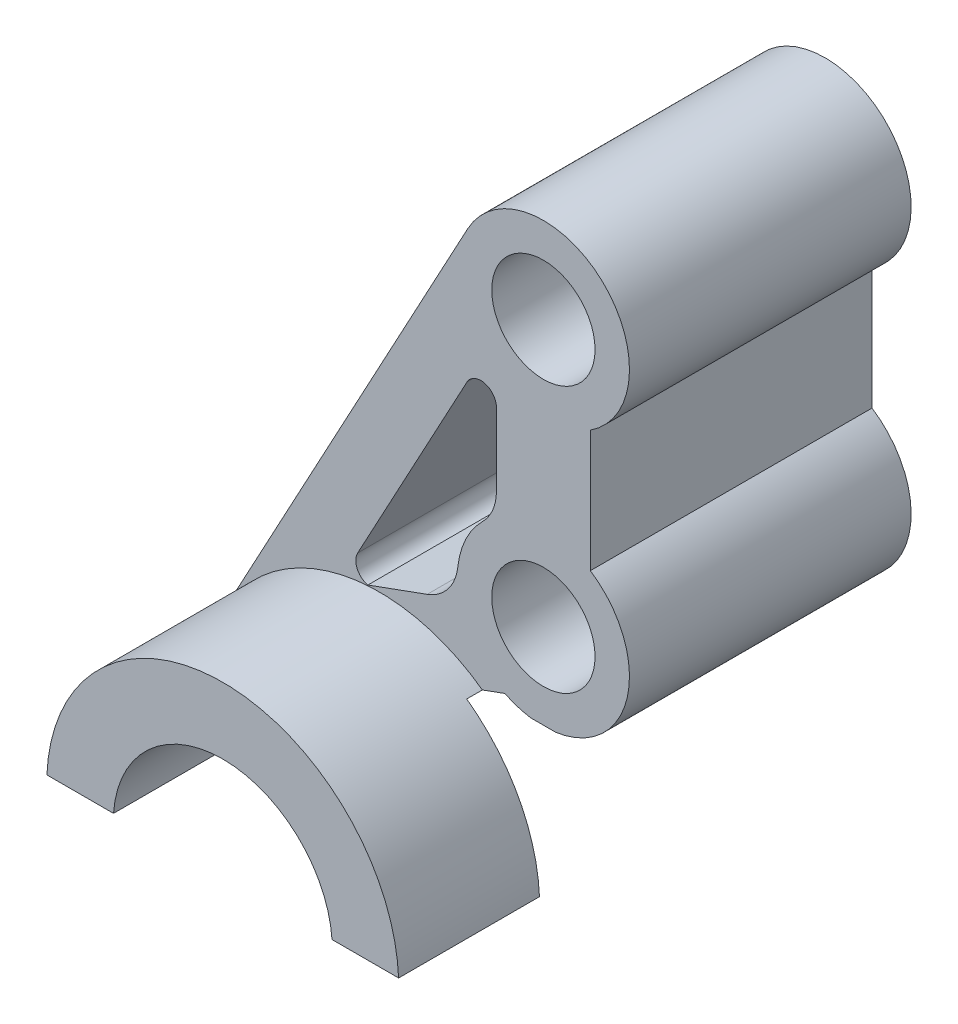
ISO-10303-21;
HEADER;
FILE_DESCRIPTION(('STEP AP214'),'2;1');
FILE_NAME('part.step','',(''),(''),'','','');
FILE_SCHEMA(('AUTOMOTIVE_DESIGN { 1 0 10303 214 1 1 1 1 }'));
ENDSEC;
DATA;
#1=APPLICATION_CONTEXT('core data for automotive mechanical design processes');
#2=APPLICATION_PROTOCOL_DEFINITION('international standard','automotive_design',2000,#1);
#3=PRODUCT_CONTEXT('',#1,'mechanical');
#4=PRODUCT('Part','Part','',(#3));
#5=PRODUCT_RELATED_PRODUCT_CATEGORY('part','',(#4));
#6=PRODUCT_DEFINITION_FORMATION('','',#4);
#7=PRODUCT_DEFINITION_CONTEXT('part definition',#1,'design');
#8=PRODUCT_DEFINITION('design','',#6,#7);
#9=PRODUCT_DEFINITION_SHAPE('','',#8);
#10=(LENGTH_UNIT() NAMED_UNIT(*) SI_UNIT(.MILLI.,.METRE.));
#11=(NAMED_UNIT(*) PLANE_ANGLE_UNIT() SI_UNIT($,.RADIAN.));
#12=(NAMED_UNIT(*) SI_UNIT($,.STERADIAN.) SOLID_ANGLE_UNIT());
#13=UNCERTAINTY_MEASURE_WITH_UNIT(LENGTH_MEASURE(1.E-05),#10,'distance_accuracy_value','');
#14=(GEOMETRIC_REPRESENTATION_CONTEXT(3) GLOBAL_UNCERTAINTY_ASSIGNED_CONTEXT((#13)) GLOBAL_UNIT_ASSIGNED_CONTEXT((#10,
#11,#12)) REPRESENTATION_CONTEXT('',''));
#15=CARTESIAN_POINT('',(0.,0.,0.));
#16=DIRECTION('',(0.,0.,1.));
#17=DIRECTION('',(1.,0.,0.));
#18=AXIS2_PLACEMENT_3D('',#15,#16,#17);
#19=CARTESIAN_POINT('',(0.,0.,2.));
#20=DIRECTION('',(0.,0.,-1.));
#21=DIRECTION('',(-1.,0.,0.));
#22=AXIS2_PLACEMENT_3D('',#19,#20,#21);
#23=CYLINDRICAL_SURFACE('',#22,5.5);
#24=CARTESIAN_POINT('',(0.,0.,-16.));
#25=DIRECTION('',(0.,0.,-1.));
#26=DIRECTION('',(-1.,0.,0.));
#27=AXIS2_PLACEMENT_3D('',#24,#25,#26);
#28=CIRCLE('',#27,5.5);
#29=CARTESIAN_POINT('',(3.,4.60977222864644,-16.));
#30=VERTEX_POINT('',#29);
#31=CARTESIAN_POINT('',(0.759288212759851,-5.4473370934764,-16.));
#32=VERTEX_POINT('',#31);
#33=EDGE_CURVE('E486',#30,#32,#28,.T.);
#34=ORIENTED_EDGE('',*,*,#33,.F.);
#35=DIRECTION('',(0.,0.,-1.));
#36=VECTOR('',#35,1.);
#37=CARTESIAN_POINT('',(3.,4.60977222864644,2.));
#38=LINE('',#37,#36);
#39=CARTESIAN_POINT('',(3.,4.60977222864644,2.));
#40=VERTEX_POINT('',#39);
#41=EDGE_CURVE('E354',#40,#30,#38,.T.);
#42=ORIENTED_EDGE('',*,*,#41,.F.);
#43=CARTESIAN_POINT('',(0.,0.,2.));
#44=DIRECTION('',(0.,0.,1.));
#45=DIRECTION('',(1.,0.,0.));
#46=AXIS2_PLACEMENT_3D('',#43,#44,#45);
#47=CIRCLE('',#46,5.5);
#48=CARTESIAN_POINT('',(0.759288212759851,-5.4473370934764,2.));
#49=VERTEX_POINT('',#48);
#50=EDGE_CURVE('E379',#49,#40,#47,.T.);
#51=ORIENTED_EDGE('',*,*,#50,.F.);
#52=DIRECTION('',(0.,0.,-1.));
#53=VECTOR('',#52,1.);
#54=CARTESIAN_POINT('',(0.759288212759851,-5.4473370934764,2.));
#55=LINE('',#54,#53);
#56=EDGE_CURVE('E419',#49,#32,#55,.T.);
#57=ORIENTED_EDGE('',*,*,#56,.T.);
#58=EDGE_LOOP('',(#34,#42,#51,#57));
#59=FACE_BOUND('',#58,.T.);
#60=ADVANCED_FACE('F65',(#59),#23,.T.);
#61=CARTESIAN_POINT('',(-10.4907117872402,-14.5574924236124,-17.));
#62=DIRECTION('',(0.,0.,1.));
#63=DIRECTION('',(1.,0.,0.));
#64=AXIS2_PLACEMENT_3D('',#61,#62,#63);
#65=CYLINDRICAL_SURFACE('',#64,11.25);
#66=DIRECTION('',(0.,0.,1.));
#67=VECTOR('',#66,1.);
#68=CARTESIAN_POINT('',(-20.3918783273174,-9.21620033782877,-17.));
#69=LINE('',#68,#67);
#70=CARTESIAN_POINT('',(-20.3918783273174,-9.21620033782877,-16.));
#71=VERTEX_POINT('',#70);
#72=CARTESIAN_POINT('',(-20.3918783273174,-9.21620033782878,2.));
#73=VERTEX_POINT('',#72);
#74=EDGE_CURVE('E398',#71,#73,#69,.T.);
#75=ORIENTED_EDGE('',*,*,#74,.F.);
#76=CARTESIAN_POINT('',(-10.4907117872402,-14.5574924236124,-16.));
#77=DIRECTION('',(0.,0.,-1.));
#78=DIRECTION('',(-1.,0.,0.));
#79=AXIS2_PLACEMENT_3D('',#76,#77,#78);
#80=CIRCLE('',#79,11.25);
#81=CARTESIAN_POINT('',(-21.7295951837347,-14.0574924236124,-16.));
#82=VERTEX_POINT('',#81);
#83=EDGE_CURVE('E489',#71,#82,#80,.F.);
#84=ORIENTED_EDGE('',*,*,#83,.T.);
#85=DIRECTION('',(0.,0.,1.));
#86=VECTOR('',#85,1.);
#87=CARTESIAN_POINT('',(-21.7295951837347,-14.0574924236124,-17.));
#88=LINE('',#87,#86);
#89=CARTESIAN_POINT('',(-21.7295951837347,-14.0574924236124,12.));
#90=VERTEX_POINT('',#89);
#91=EDGE_CURVE('E328',#82,#90,#88,.T.);
#92=ORIENTED_EDGE('',*,*,#91,.T.);
#93=CARTESIAN_POINT('',(-10.4907117872402,-14.5574924236124,12.));
#94=DIRECTION('',(0.,0.,1.));
#95=DIRECTION('',(1.,0.,0.));
#96=AXIS2_PLACEMENT_3D('',#93,#94,#95);
#97=CIRCLE('',#96,11.25);
#98=CARTESIAN_POINT('',(0.748171609254361,-14.0574924236124,12.));
#99=VERTEX_POINT('',#98);
#100=EDGE_CURVE('E343',#99,#90,#97,.T.);
#101=ORIENTED_EDGE('',*,*,#100,.F.);
#102=DIRECTION('',(0.,0.,1.));
#103=VECTOR('',#102,1.);
#104=CARTESIAN_POINT('',(0.748171609254361,-14.0574924236124,-27.));
#105=LINE('',#104,#103);
#106=CARTESIAN_POINT('',(0.748171609254361,-14.0574924236124,3.));
#107=VERTEX_POINT('',#106);
#108=EDGE_CURVE('E331',#107,#99,#105,.T.);
#109=ORIENTED_EDGE('',*,*,#108,.F.);
#110=CARTESIAN_POINT('',(-10.4907117872402,-14.5574924236124,3.));
#111=DIRECTION('',(0.,0.,-1.));
#112=DIRECTION('',(-1.,0.,0.));
#113=AXIS2_PLACEMENT_3D('',#110,#111,#112);
#114=CIRCLE('',#113,11.25);
#115=CARTESIAN_POINT('',(-3.90002088589102,-5.44018506656478,3.));
#116=VERTEX_POINT('',#115);
#117=EDGE_CURVE('E412',#107,#116,#114,.F.);
#118=ORIENTED_EDGE('',*,*,#117,.T.);
#119=DIRECTION('',(0.,0.,1.));
#120=VECTOR('',#119,1.);
#121=CARTESIAN_POINT('',(-3.90002088589102,-5.44018506656478,-17.));
#122=LINE('',#121,#120);
#123=CARTESIAN_POINT('',(-3.90002088589102,-5.44018506656478,2.));
#124=VERTEX_POINT('',#123);
#125=EDGE_CURVE('E433',#124,#116,#122,.T.);
#126=ORIENTED_EDGE('',*,*,#125,.F.);
#127=CARTESIAN_POINT('',(-10.4907117872402,-14.5574924236124,2.));
#128=DIRECTION('',(0.,0.,1.));
#129=DIRECTION('',(1.,0.,0.));
#130=AXIS2_PLACEMENT_3D('',#127,#128,#129);
#131=CIRCLE('',#130,11.25);
#132=CARTESIAN_POINT('',(-10.9485311233066,-3.31681177449134,2.));
#133=VERTEX_POINT('',#132);
#134=EDGE_CURVE('E327',#133,#124,#131,.F.);
#135=ORIENTED_EDGE('',*,*,#134,.F.);
#136=EDGE_CURVE('E324',#73,#133,#131,.F.);
#137=ORIENTED_EDGE('',*,*,#136,.F.);
#138=EDGE_LOOP('',(#75,#84,#92,#101,#109,#118,#126,#135,#137));
#139=FACE_BOUND('',#138,.T.);
#140=ADVANCED_FACE('F560',(#139),#65,.T.);
#141=CARTESIAN_POINT('',(0.,17.,2.));
#142=DIRECTION('',(0.,0.,-1.));
#143=DIRECTION('',(-1.,0.,0.));
#144=AXIS2_PLACEMENT_3D('',#141,#142,#143);
#145=CYLINDRICAL_SURFACE('',#144,5.5);
#146=CARTESIAN_POINT('',(0.,17.,-16.));
#147=DIRECTION('',(0.,0.,-1.));
#148=DIRECTION('',(-1.,0.,0.));
#149=AXIS2_PLACEMENT_3D('',#146,#147,#148);
#150=CIRCLE('',#149,5.5);
#151=CARTESIAN_POINT('',(-4.84057030848222,19.6112983530498,-16.));
#152=VERTEX_POINT('',#151);
#153=CARTESIAN_POINT('',(3.,12.3902277713536,-16.));
#154=VERTEX_POINT('',#153);
#155=EDGE_CURVE('E475',#152,#154,#150,.T.);
#156=ORIENTED_EDGE('',*,*,#155,.F.);
#157=DIRECTION('',(0.,0.,1.));
#158=VECTOR('',#157,1.);
#159=CARTESIAN_POINT('',(-4.84057030848222,19.6112983530498,-17.));
#160=LINE('',#159,#158);
#161=CARTESIAN_POINT('',(-4.84057030848222,19.6112983530498,2.));
#162=VERTEX_POINT('',#161);
#163=EDGE_CURVE('E399',#152,#162,#160,.T.);
#164=ORIENTED_EDGE('',*,*,#163,.T.);
#165=CARTESIAN_POINT('',(0.,17.,2.));
#166=DIRECTION('',(0.,0.,1.));
#167=DIRECTION('',(1.,0.,0.));
#168=AXIS2_PLACEMENT_3D('',#165,#166,#167);
#169=CIRCLE('',#168,5.5);
#170=CARTESIAN_POINT('',(3.,12.3902277713536,2.));
#171=VERTEX_POINT('',#170);
#172=EDGE_CURVE('E384',#171,#162,#169,.T.);
#173=ORIENTED_EDGE('',*,*,#172,.F.);
#174=DIRECTION('',(0.,0.,-1.));
#175=VECTOR('',#174,1.);
#176=CARTESIAN_POINT('',(3.,12.3902277713536,2.));
#177=LINE('',#176,#175);
#178=EDGE_CURVE('E358',#171,#154,#177,.T.);
#179=ORIENTED_EDGE('',*,*,#178,.T.);
#180=EDGE_LOOP('',(#156,#164,#173,#179));
#181=FACE_BOUND('',#180,.T.);
#182=ADVANCED_FACE('F554',(#181),#145,.T.);
#183=CARTESIAN_POINT('',(-10.4907117872402,-14.5574924236124,-17.));
#184=DIRECTION('',(0.,0.,1.));
#185=DIRECTION('',(1.,0.,0.));
#186=AXIS2_PLACEMENT_3D('',#183,#184,#185);
#187=CYLINDRICAL_SURFACE('',#186,7.);
#188=CARTESIAN_POINT('',(-10.4907117872402,-14.5574924236124,-16.));
#189=DIRECTION('',(0.,0.,-1.));
#190=DIRECTION('',(-1.,0.,0.));
#191=AXIS2_PLACEMENT_3D('',#188,#189,#190);
#192=CIRCLE('',#191,7.);
#193=CARTESIAN_POINT('',(-14.9736896929828,-9.18134983839169,-16.));
#194=VERTEX_POINT('',#193);
#195=CARTESIAN_POINT('',(-17.4728318091246,-14.0574924236124,-16.));
#196=VERTEX_POINT('',#195);
#197=EDGE_CURVE('E231',#194,#196,#192,.F.);
#198=ORIENTED_EDGE('',*,*,#197,.F.);
#199=DIRECTION('',(0.,0.,1.));
#200=VECTOR('',#199,1.);
#201=CARTESIAN_POINT('',(-14.9736896929828,-9.18134983839169,-17.));
#202=LINE('',#201,#200);
#203=CARTESIAN_POINT('',(-14.9736896929828,-9.18134983839169,3.));
#204=VERTEX_POINT('',#203);
#205=EDGE_CURVE('E241',#194,#204,#202,.T.);
#206=ORIENTED_EDGE('',*,*,#205,.T.);
#207=CARTESIAN_POINT('',(-10.4907117872402,-14.5574924236124,3.));
#208=DIRECTION('',(0.,0.,-1.));
#209=DIRECTION('',(-1.,0.,0.));
#210=AXIS2_PLACEMENT_3D('',#207,#208,#209);
#211=CIRCLE('',#210,7.);
#212=CARTESIAN_POINT('',(-3.50859176535568,-14.0574924236124,3.));
#213=VERTEX_POINT('',#212);
#214=EDGE_CURVE('E265',#213,#204,#211,.F.);
#215=ORIENTED_EDGE('',*,*,#214,.F.);
#216=DIRECTION('',(0.,0.,1.));
#217=VECTOR('',#216,1.);
#218=CARTESIAN_POINT('',(-3.50859176535568,-14.0574924236124,-27.));
#219=LINE('',#218,#217);
#220=CARTESIAN_POINT('',(-3.50859176535568,-14.0574924236124,12.));
#221=VERTEX_POINT('',#220);
#222=EDGE_CURVE('E334',#213,#221,#219,.T.);
#223=ORIENTED_EDGE('',*,*,#222,.T.);
#224=CARTESIAN_POINT('',(-10.4907117872402,-14.5574924236124,12.));
#225=DIRECTION('',(0.,0.,1.));
#226=DIRECTION('',(1.,0.,0.));
#227=AXIS2_PLACEMENT_3D('',#224,#225,#226);
#228=CIRCLE('',#227,7.);
#229=CARTESIAN_POINT('',(-17.4728318091246,-14.0574924236124,12.));
#230=VERTEX_POINT('',#229);
#231=EDGE_CURVE('E351',#221,#230,#228,.T.);
#232=ORIENTED_EDGE('',*,*,#231,.T.);
#233=DIRECTION('',(0.,0.,1.));
#234=VECTOR('',#233,1.);
#235=CARTESIAN_POINT('',(-17.4728318091246,-14.0574924236124,-17.));
#236=LINE('',#235,#234);
#237=EDGE_CURVE('E244',#196,#230,#236,.T.);
#238=ORIENTED_EDGE('',*,*,#237,.F.);
#239=EDGE_LOOP('',(#198,#206,#215,#223,#232,#238));
#240=FACE_BOUND('',#239,.T.);
#241=ADVANCED_FACE('F239',(#240),#187,.F.);
#242=CARTESIAN_POINT('',(0.,-14.0574924236124,-17.));
#243=DIRECTION('',(0.,1.,0.));
#244=DIRECTION('',(-1.,0.,0.));
#245=AXIS2_PLACEMENT_3D('',#242,#243,#244);
#246=PLANE('',#245);
#247=DIRECTION('',(-1.,0.,0.));
#248=VECTOR('',#247,1.);
#249=CARTESIAN_POINT('',(0.,-14.0574924236124,-16.));
#250=LINE('',#249,#248);
#251=EDGE_CURVE('E493',#196,#82,#250,.T.);
#252=ORIENTED_EDGE('',*,*,#251,.F.);
#253=ORIENTED_EDGE('',*,*,#237,.T.);
#254=DIRECTION('',(-1.,0.,0.));
#255=VECTOR('',#254,1.);
#256=CARTESIAN_POINT('',(0.,-14.0574924236124,12.));
#257=LINE('',#256,#255);
#258=EDGE_CURVE('E337',#230,#90,#257,.T.);
#259=ORIENTED_EDGE('',*,*,#258,.T.);
#260=ORIENTED_EDGE('',*,*,#91,.F.);
#261=EDGE_LOOP('',(#252,#253,#259,#260));
#262=FACE_BOUND('',#261,.T.);
#263=ADVANCED_FACE('F564',(#262),#246,.F.);
#264=CARTESIAN_POINT('',(0.,0.,-16.));
#265=DIRECTION('',(0.,0.,-1.));
#266=DIRECTION('',(-1.,0.,0.));
#267=AXIS2_PLACEMENT_3D('',#264,#265,#266);
#268=CIRCLE('',#267,5.5);
#269=CARTESIAN_POINT('',(-5.46847026730089,0.58807562068674,-16.));
#270=VERTEX_POINT('',#269);
#271=CARTESIAN_POINT('',(-3.88235294117647,3.89581001078574,-16.));
#272=VERTEX_POINT('',#271);
#273=EDGE_CURVE('E455',#270,#272,#268,.T.);
#274=ORIENTED_EDGE('',*,*,#273,.F.);
#275=DIRECTION('',(0.,0.,-1.));
#276=VECTOR('',#275,1.);
#277=CARTESIAN_POINT('',(-5.46847026730089,0.588075620686739,2.));
#278=LINE('',#277,#276);
#279=CARTESIAN_POINT('',(-5.46847026730089,0.588075620686739,2.));
#280=VERTEX_POINT('',#279);
#281=EDGE_CURVE('E314',#270,#280,#278,.F.);
#282=ORIENTED_EDGE('',*,*,#281,.T.);
#283=CARTESIAN_POINT('',(-3.88235294117647,3.89581001078574,2.));
#284=VERTEX_POINT('',#283);
#285=EDGE_CURVE('E374',#284,#280,#47,.T.);
#286=ORIENTED_EDGE('',*,*,#285,.F.);
#287=DIRECTION('',(0.,0.,-1.));
#288=VECTOR('',#287,1.);
#289=CARTESIAN_POINT('',(-3.88235294117647,3.89581001078574,2.));
#290=LINE('',#289,#288);
#291=EDGE_CURVE('E317',#284,#272,#290,.T.);
#292=ORIENTED_EDGE('',*,*,#291,.T.);
#293=EDGE_LOOP('',(#274,#282,#286,#292));
#294=FACE_BOUND('',#293,.T.);
#295=ADVANCED_FACE('F591',(#294),#23,.T.);
#296=CARTESIAN_POINT('',(0.,0.,-16.));
#297=DIRECTION('',(0.,0.,-1.));
#298=DIRECTION('',(-1.,0.,0.));
#299=AXIS2_PLACEMENT_3D('',#296,#297,#298);
#300=CIRCLE('',#299,5.5);
#301=CARTESIAN_POINT('',(-0.808941556310188,-5.44018506656478,-16.));
#302=VERTEX_POINT('',#301);
#303=CARTESIAN_POINT('',(-2.46361660128871,-4.91737666259711,-16.));
#304=VERTEX_POINT('',#303);
#305=EDGE_CURVE('E247',#302,#304,#300,.T.);
#306=ORIENTED_EDGE('',*,*,#305,.F.);
#307=DIRECTION('',(0.,0.,-1.));
#308=VECTOR('',#307,1.);
#309=CARTESIAN_POINT('',(-0.808941556310188,-5.44018506656478,2.));
#310=LINE('',#309,#308);
#311=CARTESIAN_POINT('',(-0.808941556310188,-5.44018506656478,2.));
#312=VERTEX_POINT('',#311);
#313=EDGE_CURVE('E426',#302,#312,#310,.F.);
#314=ORIENTED_EDGE('',*,*,#313,.T.);
#315=CARTESIAN_POINT('',(-2.46361660128871,-4.91737666259711,2.));
#316=VERTEX_POINT('',#315);
#317=EDGE_CURVE('E378',#316,#312,#47,.T.);
#318=ORIENTED_EDGE('',*,*,#317,.F.);
#319=DIRECTION('',(0.,0.,1.));
#320=VECTOR('',#319,1.);
#321=CARTESIAN_POINT('',(-2.46361660128871,-4.91737666259711,-17.));
#322=LINE('',#321,#320);
#323=EDGE_CURVE('E388',#304,#316,#322,.T.);
#324=ORIENTED_EDGE('',*,*,#323,.F.);
#325=EDGE_LOOP('',(#306,#314,#318,#324));
#326=FACE_BOUND('',#325,.T.);
#327=ADVANCED_FACE('F534',(#326),#23,.T.);
#328=CARTESIAN_POINT('',(-3.,0.,2.));
#329=DIRECTION('',(1.,0.,0.));
#330=DIRECTION('',(0.,1.,0.));
#331=AXIS2_PLACEMENT_3D('',#328,#329,#330);
#332=PLANE('',#331);
#333=DIRECTION('',(0.,1.,0.));
#334=VECTOR('',#333,1.);
#335=CARTESIAN_POINT('',(-3.,0.,-16.));
#336=LINE('',#335,#334);
#337=CARTESIAN_POINT('',(-3.,6.02079728939615,-16.));
#338=VERTEX_POINT('',#337);
#339=CARTESIAN_POINT('',(-3.,10.6383059352344,-16.));
#340=VERTEX_POINT('',#339);
#341=EDGE_CURVE('E458',#338,#340,#336,.T.);
#342=ORIENTED_EDGE('',*,*,#341,.F.);
#343=DIRECTION('',(0.,0.,1.));
#344=VECTOR('',#343,1.);
#345=CARTESIAN_POINT('',(-3.,6.02079728939615,2.));
#346=LINE('',#345,#344);
#347=CARTESIAN_POINT('',(-3.,6.02079728939615,2.));
#348=VERTEX_POINT('',#347);
#349=EDGE_CURVE('E307',#338,#348,#346,.T.);
#350=ORIENTED_EDGE('',*,*,#349,.T.);
#351=DIRECTION('',(0.,-1.,0.));
#352=VECTOR('',#351,1.);
#353=CARTESIAN_POINT('',(-3.,0.,2.));
#354=LINE('',#353,#352);
#355=CARTESIAN_POINT('',(-3.,10.6383059352344,2.));
#356=VERTEX_POINT('',#355);
#357=EDGE_CURVE('E380',#356,#348,#354,.T.);
#358=ORIENTED_EDGE('',*,*,#357,.F.);
#359=DIRECTION('',(0.,0.,1.));
#360=VECTOR('',#359,1.);
#361=CARTESIAN_POINT('',(-3.,10.6383059352344,2.));
#362=LINE('',#361,#360);
#363=EDGE_CURVE('E289',#356,#340,#362,.F.);
#364=ORIENTED_EDGE('',*,*,#363,.T.);
#365=EDGE_LOOP('',(#342,#350,#358,#364));
#366=FACE_BOUND('',#365,.T.);
#367=ADVANCED_FACE('F601',(#366),#332,.F.);
#368=CARTESIAN_POINT('',(0.,17.,2.));
#369=DIRECTION('',(0.,0.,-1.));
#370=DIRECTION('',(-1.,0.,0.));
#371=AXIS2_PLACEMENT_3D('',#368,#369,#370);
#372=CYLINDRICAL_SURFACE('',#371,3.3);
#373=CARTESIAN_POINT('',(0.,17.,2.));
#374=DIRECTION('',(0.,0.,1.));
#375=DIRECTION('',(1.,0.,0.));
#376=AXIS2_PLACEMENT_3D('',#373,#374,#375);
#377=CIRCLE('',#376,3.3);
#378=CARTESIAN_POINT('',(3.3,17.,2.));
#379=VERTEX_POINT('',#378);
#380=EDGE_CURVE('E366',#379,#379,#377,.T.);
#381=ORIENTED_EDGE('',*,*,#380,.T.);
#382=EDGE_LOOP('',(#381));
#383=FACE_BOUND('',#382,.T.);
#384=CARTESIAN_POINT('',(0.,17.,-16.));
#385=DIRECTION('',(0.,0.,-1.));
#386=DIRECTION('',(-1.,0.,0.));
#387=AXIS2_PLACEMENT_3D('',#384,#385,#386);
#388=CIRCLE('',#387,3.3);
#389=CARTESIAN_POINT('',(-3.3,17.,-16.));
#390=VERTEX_POINT('',#389);
#391=EDGE_CURVE('E444',#390,#390,#388,.T.);
#392=ORIENTED_EDGE('',*,*,#391,.T.);
#393=EDGE_LOOP('',(#392));
#394=FACE_BOUND('',#393,.T.);
#395=ADVANCED_FACE('F605',(#383,#394),#372,.F.);
#396=CARTESIAN_POINT('',(3.,0.,2.));
#397=DIRECTION('',(1.,0.,0.));
#398=DIRECTION('',(0.,1.,0.));
#399=AXIS2_PLACEMENT_3D('',#396,#397,#398);
#400=PLANE('',#399);
#401=ORIENTED_EDGE('',*,*,#41,.T.);
#402=DIRECTION('',(0.,1.,0.));
#403=VECTOR('',#402,1.);
#404=CARTESIAN_POINT('',(3.,0.,-16.));
#405=LINE('',#404,#403);
#406=EDGE_CURVE('E478',#30,#154,#405,.T.);
#407=ORIENTED_EDGE('',*,*,#406,.T.);
#408=ORIENTED_EDGE('',*,*,#178,.F.);
#409=DIRECTION('',(0.,-1.,0.));
#410=VECTOR('',#409,1.);
#411=CARTESIAN_POINT('',(3.,0.,2.));
#412=LINE('',#411,#410);
#413=EDGE_CURVE('E370',#171,#40,#412,.T.);
#414=ORIENTED_EDGE('',*,*,#413,.T.);
#415=EDGE_LOOP('',(#401,#407,#408,#414));
#416=FACE_BOUND('',#415,.T.);
#417=ADVANCED_FACE('F551',(#416),#400,.T.);
#418=CARTESIAN_POINT('',(0.,0.,2.));
#419=DIRECTION('',(0.,0.,-1.));
#420=DIRECTION('',(-1.,0.,0.));
#421=AXIS2_PLACEMENT_3D('',#418,#419,#420);
#422=CYLINDRICAL_SURFACE('',#421,3.3);
#423=CARTESIAN_POINT('',(0.,0.,2.));
#424=DIRECTION('',(0.,0.,1.));
#425=DIRECTION('',(1.,0.,0.));
#426=AXIS2_PLACEMENT_3D('',#423,#424,#425);
#427=CIRCLE('',#426,3.3);
#428=CARTESIAN_POINT('',(3.3,0.,2.));
#429=VERTEX_POINT('',#428);
#430=EDGE_CURVE('E362',#429,#429,#427,.T.);
#431=ORIENTED_EDGE('',*,*,#430,.T.);
#432=EDGE_LOOP('',(#431));
#433=FACE_BOUND('',#432,.T.);
#434=CARTESIAN_POINT('',(0.,0.,-16.));
#435=DIRECTION('',(0.,0.,-1.));
#436=DIRECTION('',(-1.,0.,0.));
#437=AXIS2_PLACEMENT_3D('',#434,#435,#436);
#438=CIRCLE('',#437,3.3);
#439=CARTESIAN_POINT('',(-3.3,0.,-16.));
#440=VERTEX_POINT('',#439);
#441=EDGE_CURVE('E448',#440,#440,#438,.T.);
#442=ORIENTED_EDGE('',*,*,#441,.T.);
#443=EDGE_LOOP('',(#442));
#444=FACE_BOUND('',#443,.T.);
#445=ADVANCED_FACE('F729',(#433,#444),#422,.F.);
#446=CARTESIAN_POINT('',(-0.254647497139686,0.699638248311929,-17.));
#447=DIRECTION('',(0.342020143325666,-0.939692620785909,0.));
#448=DIRECTION('',(0.939692620785909,0.342020143325666,0.));
#449=AXIS2_PLACEMENT_3D('',#446,#447,#448);
#450=PLANE('',#449);
#451=DIRECTION('',(0.939692620785909,0.342020143325666,0.));
#452=VECTOR('',#451,1.);
#453=CARTESIAN_POINT('',(-0.254647497139686,0.699638248311929,-16.));
#454=LINE('',#453,#452);
#455=CARTESIAN_POINT('',(-11.218707477269,-3.2909532311644,-16.));
#456=VERTEX_POINT('',#455);
#457=CARTESIAN_POINT('',(-7.4252118013062,-1.9102337212964,-16.));
#458=VERTEX_POINT('',#457);
#459=EDGE_CURVE('E467',#456,#458,#454,.T.);
#460=ORIENTED_EDGE('',*,*,#459,.F.);
#461=DIRECTION('',(0.,0.,1.));
#462=VECTOR('',#461,1.);
#463=CARTESIAN_POINT('',(-11.218707477269,-3.2909532311644,-17.));
#464=LINE('',#463,#462);
#465=CARTESIAN_POINT('',(-11.218707477269,-3.2909532311644,2.));
#466=VERTEX_POINT('',#465);
#467=EDGE_CURVE('E286',#456,#466,#464,.T.);
#468=ORIENTED_EDGE('',*,*,#467,.T.);
#469=DIRECTION('',(0.939692620785909,0.342020143325666,0.));
#470=VECTOR('',#469,1.);
#471=CARTESIAN_POINT('',(-0.254647497139686,0.699638248311929,2.));
#472=LINE('',#471,#470);
#473=CARTESIAN_POINT('',(-7.4252118013062,-1.9102337212964,2.));
#474=VERTEX_POINT('',#473);
#475=EDGE_CURVE('E395',#466,#474,#472,.T.);
#476=ORIENTED_EDGE('',*,*,#475,.T.);
#477=DIRECTION('',(0.,0.,1.));
#478=VECTOR('',#477,1.);
#479=CARTESIAN_POINT('',(-7.4252118013062,-1.91023372129641,-17.));
#480=LINE('',#479,#478);
#481=EDGE_CURVE('E310',#474,#458,#480,.F.);
#482=ORIENTED_EDGE('',*,*,#481,.T.);
#483=EDGE_LOOP('',(#460,#468,#476,#482));
#484=FACE_BOUND('',#483,.T.);
#485=ADVANCED_FACE('F737',(#484),#450,.F.);
#486=CARTESIAN_POINT('',(1.29222599849166,-3.55036175168807,-17.));
#487=DIRECTION('',(-0.342020143325666,0.939692620785909,0.));
#488=DIRECTION('',(-0.93969262078591,-0.342020143325666,0.));
#489=AXIS2_PLACEMENT_3D('',#486,#487,#488);
#490=PLANE('',#489);
#491=DIRECTION('',(-0.93969262078591,-0.342020143325666,0.));
#492=VECTOR('',#491,1.);
#493=CARTESIAN_POINT('',(1.29222599849166,-3.55036175168807,-16.));
#494=LINE('',#493,#492);
#495=CARTESIAN_POINT('',(-3.90002088589102,-5.44018506656478,-16.));
#496=VERTEX_POINT('',#495);
#497=EDGE_CURVE('E503',#304,#496,#494,.T.);
#498=ORIENTED_EDGE('',*,*,#497,.F.);
#499=ORIENTED_EDGE('',*,*,#323,.T.);
#500=DIRECTION('',(-0.93969262078591,-0.342020143325666,0.));
#501=VECTOR('',#500,1.);
#502=CARTESIAN_POINT('',(1.29222599849166,-3.55036175168807,2.));
#503=LINE('',#502,#501);
#504=EDGE_CURVE('E391',#316,#124,#503,.T.);
#505=ORIENTED_EDGE('',*,*,#504,.T.);
#506=DIRECTION('',(0.,0.,1.));
#507=VECTOR('',#506,1.);
#508=CARTESIAN_POINT('',(-3.90002088589103,-5.44018506656478,-17.));
#509=LINE('',#508,#507);
#510=EDGE_CURVE('E321',#496,#124,#509,.T.);
#511=ORIENTED_EDGE('',*,*,#510,.F.);
#512=EDGE_LOOP('',(#498,#499,#505,#511));
#513=FACE_BOUND('',#512,.T.);
#514=ADVANCED_FACE('F529',(#513),#490,.F.);
#515=CARTESIAN_POINT('',(-8.4512722312832,0.908844141061325,2.));
#516=DIRECTION('',(0.,0.,-1.));
#517=DIRECTION('',(-1.,0.,0.));
#518=AXIS2_PLACEMENT_3D('',#515,#516,#517);
#519=CYLINDRICAL_SURFACE('',#518,3.);
#520=CARTESIAN_POINT('',(-8.4512722312832,0.908844141061325,-16.));
#521=DIRECTION('',(0.,0.,-1.));
#522=DIRECTION('',(-1.,0.,0.));
#523=AXIS2_PLACEMENT_3D('',#520,#521,#522);
#524=CIRCLE('',#523,3.);
#525=EDGE_CURVE('E461',#458,#270,#524,.F.);
#526=ORIENTED_EDGE('',*,*,#525,.F.);
#527=ORIENTED_EDGE('',*,*,#481,.F.);
#528=CARTESIAN_POINT('',(-8.4512722312832,0.908844141061325,2.));
#529=DIRECTION('',(0.,0.,1.));
#530=DIRECTION('',(1.,0.,0.));
#531=AXIS2_PLACEMENT_3D('',#528,#529,#530);
#532=CIRCLE('',#531,3.);
#533=EDGE_CURVE('E303',#280,#474,#532,.F.);
#534=ORIENTED_EDGE('',*,*,#533,.F.);
#535=ORIENTED_EDGE('',*,*,#281,.F.);
#536=EDGE_LOOP('',(#526,#527,#534,#535));
#537=FACE_BOUND('',#536,.T.);
#538=ADVANCED_FACE('F624',(#537),#519,.F.);
#539=CARTESIAN_POINT('',(-6.,6.02079728939615,2.));
#540=DIRECTION('',(0.,0.,-1.));
#541=DIRECTION('',(-1.,0.,0.));
#542=AXIS2_PLACEMENT_3D('',#539,#540,#541);
#543=CYLINDRICAL_SURFACE('',#542,3.);
#544=CARTESIAN_POINT('',(-6.,6.02079728939615,-16.));
#545=DIRECTION('',(0.,0.,-1.));
#546=DIRECTION('',(-1.,0.,0.));
#547=AXIS2_PLACEMENT_3D('',#544,#545,#546);
#548=CIRCLE('',#547,3.);
#549=EDGE_CURVE('E452',#272,#338,#548,.F.);
#550=ORIENTED_EDGE('',*,*,#549,.F.);
#551=ORIENTED_EDGE('',*,*,#291,.F.);
#552=CARTESIAN_POINT('',(-6.,6.02079728939615,2.));
#553=DIRECTION('',(0.,0.,1.));
#554=DIRECTION('',(1.,0.,0.));
#555=AXIS2_PLACEMENT_3D('',#552,#553,#554);
#556=CIRCLE('',#555,3.);
#557=EDGE_CURVE('E300',#348,#284,#556,.F.);
#558=ORIENTED_EDGE('',*,*,#557,.F.);
#559=ORIENTED_EDGE('',*,*,#349,.F.);
#560=EDGE_LOOP('',(#550,#551,#558,#559));
#561=FACE_BOUND('',#560,.T.);
#562=ADVANCED_FACE('F627',(#561),#543,.F.);
#563=CARTESIAN_POINT('',(-11.9441387601893,6.44339569212037,-17.));
#564=DIRECTION('',(-0.880103692451312,0.474781518736319,0.));
#565=DIRECTION('',(-0.474781518736319,-0.880103692451312,0.));
#566=AXIS2_PLACEMENT_3D('',#563,#564,#565);
#567=PLANE('',#566);
#568=ORIENTED_EDGE('',*,*,#163,.F.);
#569=DIRECTION('',(-0.474781518736319,-0.880103692451312,0.));
#570=VECTOR('',#569,1.);
#571=CARTESIAN_POINT('',(-11.9441387601893,6.44339569212037,-16.));
#572=LINE('',#571,#570);
#573=EDGE_CURVE('E482',#152,#71,#572,.T.);
#574=ORIENTED_EDGE('',*,*,#573,.T.);
#575=ORIENTED_EDGE('',*,*,#74,.T.);
#576=DIRECTION('',(-0.474781518736319,-0.880103692451312,0.));
#577=VECTOR('',#576,1.);
#578=CARTESIAN_POINT('',(-11.9441387601893,6.44339569212037,2.));
#579=LINE('',#578,#577);
#580=EDGE_CURVE('E402',#162,#73,#579,.T.);
#581=ORIENTED_EDGE('',*,*,#580,.F.);
#582=EDGE_LOOP('',(#568,#574,#575,#581));
#583=FACE_BOUND('',#582,.T.);
#584=ADVANCED_FACE('F558',(#583),#567,.T.);
#585=CARTESIAN_POINT('',(-8.42372399038407,4.54426961717509,-17.));
#586=DIRECTION('',(0.880103692451313,-0.474781518736319,0.));
#587=DIRECTION('',(0.474781518736319,0.880103692451313,0.));
#588=AXIS2_PLACEMENT_3D('',#585,#586,#587);
#589=PLANE('',#588);
#590=DIRECTION('',(0.,0.,-1.));
#591=VECTOR('',#590,1.);
#592=CARTESIAN_POINT('',(-11.8693298678527,-1.84285864249982,-17.));
#593=LINE('',#592,#591);
#594=CARTESIAN_POINT('',(-11.8693298678527,-1.84285864249983,2.));
#595=VERTEX_POINT('',#594);
#596=CARTESIAN_POINT('',(-11.8693298678527,-1.84285864249982,-16.));
#597=VERTEX_POINT('',#596);
#598=EDGE_CURVE('E296',#595,#597,#593,.T.);
#599=ORIENTED_EDGE('',*,*,#598,.T.);
#600=DIRECTION('',(0.474781518736319,0.880103692451313,0.));
#601=VECTOR('',#600,1.);
#602=CARTESIAN_POINT('',(-8.42372399038407,4.54426961717509,-16.));
#603=LINE('',#602,#601);
#604=CARTESIAN_POINT('',(-4.88010369245131,11.1130874539707,-16.));
#605=VERTEX_POINT('',#604);
#606=EDGE_CURVE('E81',#597,#605,#603,.T.);
#607=ORIENTED_EDGE('',*,*,#606,.T.);
#608=DIRECTION('',(0.,0.,1.));
#609=VECTOR('',#608,1.);
#610=CARTESIAN_POINT('',(-4.88010369245132,11.1130874539707,-17.));
#611=LINE('',#610,#609);
#612=CARTESIAN_POINT('',(-4.88010369245131,11.1130874539707,2.));
#613=VERTEX_POINT('',#612);
#614=EDGE_CURVE('E293',#605,#613,#611,.T.);
#615=ORIENTED_EDGE('',*,*,#614,.T.);
#616=DIRECTION('',(0.474781518736319,0.880103692451313,0.));
#617=VECTOR('',#616,1.);
#618=CARTESIAN_POINT('',(-8.42372399038407,4.54426961717509,2.));
#619=LINE('',#618,#617);
#620=EDGE_CURVE('E408',#595,#613,#619,.T.);
#621=ORIENTED_EDGE('',*,*,#620,.F.);
#622=EDGE_LOOP('',(#599,#607,#615,#621));
#623=FACE_BOUND('',#622,.T.);
#624=ADVANCED_FACE('F633',(#623),#589,.T.);
#625=CARTESIAN_POINT('',(-4.,10.6383059352344,-17.));
#626=DIRECTION('',(0.,0.,1.));
#627=DIRECTION('',(1.,0.,0.));
#628=AXIS2_PLACEMENT_3D('',#625,#626,#627);
#629=CYLINDRICAL_SURFACE('',#628,1.);
#630=CARTESIAN_POINT('',(-4.,10.6383059352344,-16.));
#631=DIRECTION('',(0.,0.,-1.));
#632=DIRECTION('',(-1.,0.,0.));
#633=AXIS2_PLACEMENT_3D('',#630,#631,#632);
#634=CIRCLE('',#633,1.);
#635=EDGE_CURVE('E464',#340,#605,#634,.F.);
#636=ORIENTED_EDGE('',*,*,#635,.F.);
#637=ORIENTED_EDGE('',*,*,#363,.F.);
#638=CARTESIAN_POINT('',(-4.,10.6383059352344,2.));
#639=DIRECTION('',(0.,0.,1.));
#640=DIRECTION('',(1.,0.,0.));
#641=AXIS2_PLACEMENT_3D('',#638,#639,#640);
#642=CIRCLE('',#641,1.);
#643=EDGE_CURVE('E279',#613,#356,#642,.F.);
#644=ORIENTED_EDGE('',*,*,#643,.F.);
#645=ORIENTED_EDGE('',*,*,#614,.F.);
#646=EDGE_LOOP('',(#636,#637,#644,#645));
#647=FACE_BOUND('',#646,.T.);
#648=ADVANCED_FACE('F584',(#647),#629,.F.);
#649=CARTESIAN_POINT('',(-10.9892261754014,-2.31764016123614,-17.));
#650=DIRECTION('',(0.,0.,1.));
#651=DIRECTION('',(1.,0.,0.));
#652=AXIS2_PLACEMENT_3D('',#649,#650,#651);
#653=CYLINDRICAL_SURFACE('',#652,1.);
#654=CARTESIAN_POINT('',(-10.9892261754014,-2.31764016123614,-16.));
#655=DIRECTION('',(0.,0.,-1.));
#656=DIRECTION('',(-1.,0.,0.));
#657=AXIS2_PLACEMENT_3D('',#654,#655,#656);
#658=CIRCLE('',#657,1.);
#659=EDGE_CURVE('E472',#597,#456,#658,.F.);
#660=ORIENTED_EDGE('',*,*,#659,.F.);
#661=ORIENTED_EDGE('',*,*,#598,.F.);
#662=CARTESIAN_POINT('',(-10.9892261754014,-2.31764016123614,2.));
#663=DIRECTION('',(0.,0.,1.));
#664=DIRECTION('',(1.,0.,0.));
#665=AXIS2_PLACEMENT_3D('',#662,#663,#664);
#666=CIRCLE('',#665,1.);
#667=EDGE_CURVE('E274',#466,#595,#666,.F.);
#668=ORIENTED_EDGE('',*,*,#667,.F.);
#669=ORIENTED_EDGE('',*,*,#467,.F.);
#670=EDGE_LOOP('',(#660,#661,#668,#669));
#671=FACE_BOUND('',#670,.T.);
#672=ADVANCED_FACE('F577',(#671),#653,.F.);
#673=CARTESIAN_POINT('',(0.759288212759851,-5.44018506656478,3.));
#674=DIRECTION('',(0.,1.,0.));
#675=DIRECTION('',(-1.,0.,0.));
#676=AXIS2_PLACEMENT_3D('',#673,#674,#675);
#677=PLANE('',#676);
#678=DIRECTION('',(-1.,0.,0.));
#679=VECTOR('',#678,1.);
#680=CARTESIAN_POINT('',(0.759288212759851,-5.44018506656478,-16.));
#681=LINE('',#680,#679);
#682=CARTESIAN_POINT('',(-9.57344263647011,-5.44018506656478,-16.));
#683=VERTEX_POINT('',#682);
#684=EDGE_CURVE('E506',#496,#683,#681,.T.);
#685=ORIENTED_EDGE('',*,*,#684,.F.);
#686=ORIENTED_EDGE('',*,*,#510,.T.);
#687=ORIENTED_EDGE('',*,*,#125,.T.);
#688=DIRECTION('',(1.,0.,0.));
#689=VECTOR('',#688,1.);
#690=CARTESIAN_POINT('',(0.759288212759851,-5.44018506656478,3.));
#691=LINE('',#690,#689);
#692=CARTESIAN_POINT('',(-9.57344263647011,-5.44018506656478,3.));
#693=VERTEX_POINT('',#692);
#694=EDGE_CURVE('E441',#693,#116,#691,.T.);
#695=ORIENTED_EDGE('',*,*,#694,.F.);
#696=DIRECTION('',(0.,0.,1.));
#697=VECTOR('',#696,1.);
#698=CARTESIAN_POINT('',(-9.57344263647011,-5.44018506656478,3.));
#699=LINE('',#698,#697);
#700=EDGE_CURVE('E257',#693,#683,#699,.F.);
#701=ORIENTED_EDGE('',*,*,#700,.T.);
#702=EDGE_LOOP('',(#685,#686,#687,#695,#701));
#703=FACE_BOUND('',#702,.T.);
#704=ADVANCED_FACE('F575',(#703),#677,.F.);
#705=CARTESIAN_POINT('',(0.759288212759851,-5.44018506656478,3.));
#706=DIRECTION('',(1.,0.,0.));
#707=DIRECTION('',(0.,1.,0.));
#708=AXIS2_PLACEMENT_3D('',#705,#706,#707);
#709=PLANE('',#708);
#710=DIRECTION('',(0.,1.,0.));
#711=VECTOR('',#710,1.);
#712=CARTESIAN_POINT('',(0.759288212759851,-5.44018506656478,-16.));
#713=LINE('',#712,#711);
#714=CARTESIAN_POINT('',(0.759288212759851,-5.44018506656478,-16.));
#715=VERTEX_POINT('',#714);
#716=EDGE_CURVE('E496',#32,#715,#713,.T.);
#717=ORIENTED_EDGE('',*,*,#716,.F.);
#718=ORIENTED_EDGE('',*,*,#56,.F.);
#719=DIRECTION('',(0.,1.,0.));
#720=VECTOR('',#719,1.);
#721=CARTESIAN_POINT('',(0.759288212759852,0.,2.));
#722=LINE('',#721,#720);
#723=CARTESIAN_POINT('',(0.759288212759851,-5.44018506656478,2.));
#724=VERTEX_POINT('',#723);
#725=EDGE_CURVE('E423',#49,#724,#722,.T.);
#726=ORIENTED_EDGE('',*,*,#725,.T.);
#727=DIRECTION('',(0.,0.,-1.));
#728=VECTOR('',#727,1.);
#729=CARTESIAN_POINT('',(0.759288212759851,-5.44018506656478,3.));
#730=LINE('',#729,#728);
#731=EDGE_CURVE('E437',#724,#715,#730,.T.);
#732=ORIENTED_EDGE('',*,*,#731,.T.);
#733=EDGE_LOOP('',(#717,#718,#726,#732));
#734=FACE_BOUND('',#733,.T.);
#735=ADVANCED_FACE('F544',(#734),#709,.F.);
#736=DIRECTION('',(-1.,0.,0.));
#737=VECTOR('',#736,1.);
#738=CARTESIAN_POINT('',(0.759288212759851,-5.44018506656478,-16.));
#739=LINE('',#738,#737);
#740=EDGE_CURVE('E246',#715,#302,#739,.T.);
#741=ORIENTED_EDGE('',*,*,#740,.F.);
#742=ORIENTED_EDGE('',*,*,#731,.F.);
#743=DIRECTION('',(-1.,0.,0.));
#744=VECTOR('',#743,1.);
#745=CARTESIAN_POINT('',(0.,-5.44018506656478,2.));
#746=LINE('',#745,#744);
#747=EDGE_CURVE('E429',#724,#312,#746,.T.);
#748=ORIENTED_EDGE('',*,*,#747,.T.);
#749=ORIENTED_EDGE('',*,*,#313,.F.);
#750=EDGE_LOOP('',(#741,#742,#748,#749));
#751=FACE_BOUND('',#750,.T.);
#752=ADVANCED_FACE('F541',(#751),#677,.F.);
#753=CARTESIAN_POINT('',(-9.57344263647011,-10.4401850665648,-17.));
#754=DIRECTION('',(0.,0.,1.));
#755=DIRECTION('',(1.,0.,0.));
#756=AXIS2_PLACEMENT_3D('',#753,#754,#755);
#757=CYLINDRICAL_SURFACE('',#756,5.);
#758=CARTESIAN_POINT('',(-9.57344263647011,-10.4401850665648,-16.));
#759=DIRECTION('',(0.,0.,-1.));
#760=DIRECTION('',(-1.,0.,0.));
#761=AXIS2_PLACEMENT_3D('',#758,#759,#760);
#762=CIRCLE('',#761,5.);
#763=CARTESIAN_POINT('',(-13.8746297024917,-7.89071652918514,-16.));
#764=VERTEX_POINT('',#763);
#765=EDGE_CURVE('E89',#683,#764,#762,.F.);
#766=ORIENTED_EDGE('',*,*,#765,.F.);
#767=ORIENTED_EDGE('',*,*,#700,.F.);
#768=CARTESIAN_POINT('',(-9.57344263647011,-10.4401850665648,3.));
#769=DIRECTION('',(0.,0.,-1.));
#770=DIRECTION('',(-1.,0.,0.));
#771=AXIS2_PLACEMENT_3D('',#768,#769,#770);
#772=CIRCLE('',#771,5.);
#773=CARTESIAN_POINT('',(-13.8746297024917,-7.89071652918514,3.));
#774=VERTEX_POINT('',#773);
#775=EDGE_CURVE('E252',#774,#693,#772,.T.);
#776=ORIENTED_EDGE('',*,*,#775,.F.);
#777=DIRECTION('',(0.,0.,1.));
#778=VECTOR('',#777,1.);
#779=CARTESIAN_POINT('',(-13.8746297024917,-7.89071652918514,-17.));
#780=LINE('',#779,#778);
#781=EDGE_CURVE('E251',#774,#764,#780,.F.);
#782=ORIENTED_EDGE('',*,*,#781,.T.);
#783=EDGE_LOOP('',(#766,#767,#776,#782));
#784=FACE_BOUND('',#783,.T.);
#785=ADVANCED_FACE('F268',(#784),#757,.F.);
#786=CARTESIAN_POINT('',(-18.1758167685133,-5.34124799180549,-17.));
#787=DIRECTION('',(0.,0.,1.));
#788=DIRECTION('',(1.,0.,0.));
#789=AXIS2_PLACEMENT_3D('',#786,#787,#788);
#790=CYLINDRICAL_SURFACE('',#789,5.);
#791=ORIENTED_EDGE('',*,*,#205,.F.);
#792=CARTESIAN_POINT('',(-18.1758167685133,-5.34124799180549,-16.));
#793=DIRECTION('',(0.,0.,-1.));
#794=DIRECTION('',(-1.,0.,0.));
#795=AXIS2_PLACEMENT_3D('',#792,#793,#794);
#796=CIRCLE('',#795,5.);
#797=EDGE_CURVE('E12',#194,#764,#796,.F.);
#798=ORIENTED_EDGE('',*,*,#797,.T.);
#799=ORIENTED_EDGE('',*,*,#781,.F.);
#800=CARTESIAN_POINT('',(-18.1758167685133,-5.34124799180549,3.));
#801=DIRECTION('',(0.,0.,-1.));
#802=DIRECTION('',(-1.,0.,0.));
#803=AXIS2_PLACEMENT_3D('',#800,#801,#802);
#804=CIRCLE('',#803,5.);
#805=EDGE_CURVE('E74',#204,#774,#804,.F.);
#806=ORIENTED_EDGE('',*,*,#805,.F.);
#807=EDGE_LOOP('',(#791,#798,#799,#806));
#808=FACE_BOUND('',#807,.T.);
#809=ADVANCED_FACE('F67',(#808),#790,.T.);
#810=CARTESIAN_POINT('',(0.,-14.0574924236124,-27.));
#811=DIRECTION('',(0.,1.,0.));
#812=DIRECTION('',(-1.,0.,0.));
#813=AXIS2_PLACEMENT_3D('',#810,#811,#812);
#814=PLANE('',#813);
#815=DIRECTION('',(-1.,0.,0.));
#816=VECTOR('',#815,1.);
#817=CARTESIAN_POINT('',(0.,-14.0574924236124,3.));
#818=LINE('',#817,#816);
#819=EDGE_CURVE('E416',#107,#213,#818,.T.);
#820=ORIENTED_EDGE('',*,*,#819,.F.);
#821=ORIENTED_EDGE('',*,*,#108,.T.);
#822=DIRECTION('',(-1.,0.,0.));
#823=VECTOR('',#822,1.);
#824=CARTESIAN_POINT('',(0.,-14.0574924236124,12.));
#825=LINE('',#824,#823);
#826=EDGE_CURVE('E347',#99,#221,#825,.T.);
#827=ORIENTED_EDGE('',*,*,#826,.T.);
#828=ORIENTED_EDGE('',*,*,#222,.F.);
#829=EDGE_LOOP('',(#820,#821,#827,#828));
#830=FACE_BOUND('',#829,.T.);
#831=ADVANCED_FACE('F573',(#830),#814,.F.);
#832=CARTESIAN_POINT('',(0.,0.,12.));
#833=DIRECTION('',(0.,0.,1.));
#834=DIRECTION('',(1.,0.,0.));
#835=AXIS2_PLACEMENT_3D('',#832,#833,#834);
#836=PLANE('',#835);
#837=ORIENTED_EDGE('',*,*,#231,.F.);
#838=ORIENTED_EDGE('',*,*,#826,.F.);
#839=ORIENTED_EDGE('',*,*,#100,.T.);
#840=ORIENTED_EDGE('',*,*,#258,.F.);
#841=EDGE_LOOP('',(#837,#838,#839,#840));
#842=FACE_BOUND('',#841,.T.);
#843=ADVANCED_FACE('F568',(#842),#836,.T.);
#844=CARTESIAN_POINT('',(0.,0.,2.));
#845=DIRECTION('',(0.,0.,1.));
#846=DIRECTION('',(1.,0.,0.));
#847=AXIS2_PLACEMENT_3D('',#844,#845,#846);
#848=PLANE('',#847);
#849=ORIENTED_EDGE('',*,*,#134,.T.);
#850=ORIENTED_EDGE('',*,*,#504,.F.);
#851=ORIENTED_EDGE('',*,*,#317,.T.);
#852=ORIENTED_EDGE('',*,*,#747,.F.);
#853=ORIENTED_EDGE('',*,*,#725,.F.);
#854=ORIENTED_EDGE('',*,*,#50,.T.);
#855=ORIENTED_EDGE('',*,*,#413,.F.);
#856=ORIENTED_EDGE('',*,*,#172,.T.);
#857=ORIENTED_EDGE('',*,*,#580,.T.);
#858=ORIENTED_EDGE('',*,*,#136,.T.);
#859=EDGE_LOOP('',(#849,#850,#851,#852,#853,#854,#855,#856,#857,#858));
#860=FACE_BOUND('',#859,.T.);
#861=ORIENTED_EDGE('',*,*,#667,.T.);
#862=ORIENTED_EDGE('',*,*,#620,.T.);
#863=ORIENTED_EDGE('',*,*,#643,.T.);
#864=ORIENTED_EDGE('',*,*,#357,.T.);
#865=ORIENTED_EDGE('',*,*,#557,.T.);
#866=ORIENTED_EDGE('',*,*,#285,.T.);
#867=ORIENTED_EDGE('',*,*,#533,.T.);
#868=ORIENTED_EDGE('',*,*,#475,.F.);
#869=EDGE_LOOP('',(#861,#862,#863,#864,#865,#866,#867,#868));
#870=FACE_BOUND('',#869,.T.);
#871=ORIENTED_EDGE('',*,*,#380,.F.);
#872=EDGE_LOOP('',(#871));
#873=FACE_BOUND('',#872,.T.);
#874=ORIENTED_EDGE('',*,*,#430,.F.);
#875=EDGE_LOOP('',(#874));
#876=FACE_BOUND('',#875,.T.);
#877=ADVANCED_FACE('F519',(#860,#870,#873,#876),#848,.T.);
#878=CARTESIAN_POINT('',(0.,0.,3.));
#879=DIRECTION('',(0.,0.,-1.));
#880=DIRECTION('',(-1.,0.,0.));
#881=AXIS2_PLACEMENT_3D('',#878,#879,#880);
#882=PLANE('',#881);
#883=ORIENTED_EDGE('',*,*,#214,.T.);
#884=ORIENTED_EDGE('',*,*,#805,.T.);
#885=ORIENTED_EDGE('',*,*,#775,.T.);
#886=ORIENTED_EDGE('',*,*,#694,.T.);
#887=ORIENTED_EDGE('',*,*,#117,.F.);
#888=ORIENTED_EDGE('',*,*,#819,.T.);
#889=EDGE_LOOP('',(#883,#884,#885,#886,#887,#888));
#890=FACE_BOUND('',#889,.T.);
#891=ADVANCED_FACE('F263',(#890),#882,.T.);
#892=CARTESIAN_POINT('',(0.,0.,-16.));
#893=DIRECTION('',(0.,0.,-1.));
#894=DIRECTION('',(-1.,0.,0.));
#895=AXIS2_PLACEMENT_3D('',#892,#893,#894);
#896=PLANE('',#895);
#897=ORIENTED_EDGE('',*,*,#391,.F.);
#898=EDGE_LOOP('',(#897));
#899=FACE_BOUND('',#898,.T.);
#900=ORIENTED_EDGE('',*,*,#441,.F.);
#901=EDGE_LOOP('',(#900));
#902=FACE_BOUND('',#901,.T.);
#903=ORIENTED_EDGE('',*,*,#155,.T.);
#904=ORIENTED_EDGE('',*,*,#406,.F.);
#905=ORIENTED_EDGE('',*,*,#33,.T.);
#906=ORIENTED_EDGE('',*,*,#716,.T.);
#907=ORIENTED_EDGE('',*,*,#740,.T.);
#908=ORIENTED_EDGE('',*,*,#305,.T.);
#909=ORIENTED_EDGE('',*,*,#497,.T.);
#910=ORIENTED_EDGE('',*,*,#684,.T.);
#911=ORIENTED_EDGE('',*,*,#765,.T.);
#912=ORIENTED_EDGE('',*,*,#797,.F.);
#913=ORIENTED_EDGE('',*,*,#197,.T.);
#914=ORIENTED_EDGE('',*,*,#251,.T.);
#915=ORIENTED_EDGE('',*,*,#83,.F.);
#916=ORIENTED_EDGE('',*,*,#573,.F.);
#917=EDGE_LOOP('',(#903,#904,#905,#906,#907,#908,#909,#910,#911,#912,#913,#914,#915,#916));
#918=FACE_BOUND('',#917,.T.);
#919=ORIENTED_EDGE('',*,*,#549,.T.);
#920=ORIENTED_EDGE('',*,*,#341,.T.);
#921=ORIENTED_EDGE('',*,*,#635,.T.);
#922=ORIENTED_EDGE('',*,*,#606,.F.);
#923=ORIENTED_EDGE('',*,*,#659,.T.);
#924=ORIENTED_EDGE('',*,*,#459,.T.);
#925=ORIENTED_EDGE('',*,*,#525,.T.);
#926=ORIENTED_EDGE('',*,*,#273,.T.);
#927=EDGE_LOOP('',(#919,#920,#921,#922,#923,#924,#925,#926));
#928=FACE_BOUND('',#927,.T.);
#929=ADVANCED_FACE('F230',(#899,#902,#918,#928),#896,.T.);
#930=CLOSED_SHELL('',(#60,#140,#182,#241,#263,#295,#327,#367,#395,#417,#445,#485,#514,#538,#562,
#584,#624,#648,#672,#704,#735,#752,#785,#809,#831,#843,#877,#891,#929));
#931=MANIFOLD_SOLID_BREP('B2',#930);
#932=ADVANCED_BREP_SHAPE_REPRESENTATION('',(#18,#931),#14);
#933=SHAPE_DEFINITION_REPRESENTATION(#9,#932);
ENDSEC;
END-ISO-10303-21;
